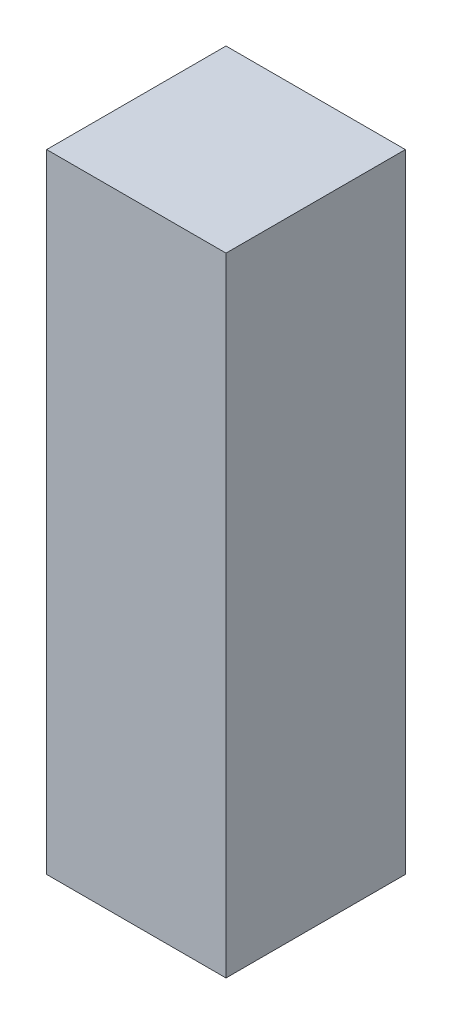
ISO-10303-21;
HEADER;
FILE_DESCRIPTION(('STEP AP214'),'2;1');
FILE_NAME('part.step','',(''),(''),'','','');
FILE_SCHEMA(('AUTOMOTIVE_DESIGN { 1 0 10303 214 1 1 1 1 }'));
ENDSEC;
DATA;
#1=APPLICATION_CONTEXT('core data for automotive mechanical design processes');
#2=APPLICATION_PROTOCOL_DEFINITION('international standard','automotive_design',2000,#1);
#3=PRODUCT_CONTEXT('',#1,'mechanical');
#4=PRODUCT('Part','Part','',(#3));
#5=PRODUCT_RELATED_PRODUCT_CATEGORY('part','',(#4));
#6=PRODUCT_DEFINITION_FORMATION('','',#4);
#7=PRODUCT_DEFINITION_CONTEXT('part definition',#1,'design');
#8=PRODUCT_DEFINITION('design','',#6,#7);
#9=PRODUCT_DEFINITION_SHAPE('','',#8);
#10=(LENGTH_UNIT() NAMED_UNIT(*) SI_UNIT(.MILLI.,.METRE.));
#11=(NAMED_UNIT(*) PLANE_ANGLE_UNIT() SI_UNIT($,.RADIAN.));
#12=(NAMED_UNIT(*) SI_UNIT($,.STERADIAN.) SOLID_ANGLE_UNIT());
#13=UNCERTAINTY_MEASURE_WITH_UNIT(LENGTH_MEASURE(1.E-05),#10,'distance_accuracy_value','');
#14=(GEOMETRIC_REPRESENTATION_CONTEXT(3) GLOBAL_UNCERTAINTY_ASSIGNED_CONTEXT((#13)) GLOBAL_UNIT_ASSIGNED_CONTEXT((#10,
#11,#12)) REPRESENTATION_CONTEXT('',''));
#15=CARTESIAN_POINT('',(0.,0.,0.));
#16=DIRECTION('',(0.,0.,1.));
#17=DIRECTION('',(1.,0.,0.));
#18=AXIS2_PLACEMENT_3D('',#15,#16,#17);
#19=CARTESIAN_POINT('',(12.7,44.45,12.7));
#20=DIRECTION('',(-1.,0.,0.));
#21=DIRECTION('',(0.,0.,1.));
#22=AXIS2_PLACEMENT_3D('',#19,#20,#21);
#23=PLANE('',#22);
#24=DIRECTION('',(0.,0.,-1.));
#25=VECTOR('',#24,1.);
#26=CARTESIAN_POINT('',(12.7,-44.45,12.7));
#27=LINE('',#26,#25);
#28=CARTESIAN_POINT('',(12.7,-44.45,12.7));
#29=VERTEX_POINT('',#28);
#30=CARTESIAN_POINT('',(12.7,-44.45,-12.7));
#31=VERTEX_POINT('',#30);
#32=EDGE_CURVE('E107',#29,#31,#27,.T.);
#33=ORIENTED_EDGE('',*,*,#32,.T.);
#34=DIRECTION('',(0.,-1.,0.));
#35=VECTOR('',#34,1.);
#36=CARTESIAN_POINT('',(12.7,44.45,-12.7));
#37=LINE('',#36,#35);
#38=CARTESIAN_POINT('',(12.7,44.45,-12.7));
#39=VERTEX_POINT('',#38);
#40=EDGE_CURVE('E11',#39,#31,#37,.T.);
#41=ORIENTED_EDGE('',*,*,#40,.F.);
#42=DIRECTION('',(0.,0.,-1.));
#43=VECTOR('',#42,1.);
#44=CARTESIAN_POINT('',(12.7,44.45,12.7));
#45=LINE('',#44,#43);
#46=CARTESIAN_POINT('',(12.7,44.45,12.7));
#47=VERTEX_POINT('',#46);
#48=EDGE_CURVE('E91',#47,#39,#45,.T.);
#49=ORIENTED_EDGE('',*,*,#48,.F.);
#50=DIRECTION('',(0.,-1.,0.));
#51=VECTOR('',#50,1.);
#52=CARTESIAN_POINT('',(12.7,44.45,12.7));
#53=LINE('',#52,#51);
#54=EDGE_CURVE('E103',#47,#29,#53,.T.);
#55=ORIENTED_EDGE('',*,*,#54,.T.);
#56=EDGE_LOOP('',(#33,#41,#49,#55));
#57=FACE_BOUND('',#56,.T.);
#58=ADVANCED_FACE('F39',(#57),#23,.F.);
#59=CARTESIAN_POINT('',(-12.7,44.45,-12.7));
#60=DIRECTION('',(0.,0.,1.));
#61=DIRECTION('',(1.,0.,0.));
#62=AXIS2_PLACEMENT_3D('',#59,#60,#61);
#63=PLANE('',#62);
#64=DIRECTION('',(-1.,0.,0.));
#65=VECTOR('',#64,1.);
#66=CARTESIAN_POINT('',(-12.7,-44.45,-12.7));
#67=LINE('',#66,#65);
#68=CARTESIAN_POINT('',(-12.7,-44.45,-12.7));
#69=VERTEX_POINT('',#68);
#70=EDGE_CURVE('E96',#31,#69,#67,.T.);
#71=ORIENTED_EDGE('',*,*,#70,.T.);
#72=DIRECTION('',(0.,-1.,0.));
#73=VECTOR('',#72,1.);
#74=CARTESIAN_POINT('',(-12.7,44.45,-12.7));
#75=LINE('',#74,#73);
#76=CARTESIAN_POINT('',(-12.7,44.45,-12.7));
#77=VERTEX_POINT('',#76);
#78=EDGE_CURVE('E48',#77,#69,#75,.T.);
#79=ORIENTED_EDGE('',*,*,#78,.F.);
#80=DIRECTION('',(-1.,0.,0.));
#81=VECTOR('',#80,1.);
#82=CARTESIAN_POINT('',(-12.7,44.45,-12.7));
#83=LINE('',#82,#81);
#84=EDGE_CURVE('E86',#39,#77,#83,.T.);
#85=ORIENTED_EDGE('',*,*,#84,.F.);
#86=ORIENTED_EDGE('',*,*,#40,.T.);
#87=EDGE_LOOP('',(#71,#79,#85,#86));
#88=FACE_BOUND('',#87,.T.);
#89=ADVANCED_FACE('F95',(#88),#63,.F.);
#90=CARTESIAN_POINT('',(-12.7,44.45,12.7));
#91=DIRECTION('',(1.,0.,0.));
#92=DIRECTION('',(0.,0.,-1.));
#93=AXIS2_PLACEMENT_3D('',#90,#91,#92);
#94=PLANE('',#93);
#95=DIRECTION('',(0.,0.,1.));
#96=VECTOR('',#95,1.);
#97=CARTESIAN_POINT('',(-12.7,-44.45,12.7));
#98=LINE('',#97,#96);
#99=CARTESIAN_POINT('',(-12.7,-44.45,12.7));
#100=VERTEX_POINT('',#99);
#101=EDGE_CURVE('E73',#69,#100,#98,.T.);
#102=ORIENTED_EDGE('',*,*,#101,.T.);
#103=DIRECTION('',(0.,-1.,0.));
#104=VECTOR('',#103,1.);
#105=CARTESIAN_POINT('',(-12.7,44.45,12.7));
#106=LINE('',#105,#104);
#107=CARTESIAN_POINT('',(-12.7,44.45,12.7));
#108=VERTEX_POINT('',#107);
#109=EDGE_CURVE('E98',#108,#100,#106,.T.);
#110=ORIENTED_EDGE('',*,*,#109,.F.);
#111=DIRECTION('',(0.,0.,1.));
#112=VECTOR('',#111,1.);
#113=CARTESIAN_POINT('',(-12.7,44.45,12.7));
#114=LINE('',#113,#112);
#115=EDGE_CURVE('E89',#77,#108,#114,.T.);
#116=ORIENTED_EDGE('',*,*,#115,.F.);
#117=ORIENTED_EDGE('',*,*,#78,.T.);
#118=EDGE_LOOP('',(#102,#110,#116,#117));
#119=FACE_BOUND('',#118,.T.);
#120=ADVANCED_FACE('F99',(#119),#94,.F.);
#121=CARTESIAN_POINT('',(-12.7,44.45,12.7));
#122=DIRECTION('',(0.,0.,-1.));
#123=DIRECTION('',(-1.,0.,0.));
#124=AXIS2_PLACEMENT_3D('',#121,#122,#123);
#125=PLANE('',#124);
#126=DIRECTION('',(1.,0.,0.));
#127=VECTOR('',#126,1.);
#128=CARTESIAN_POINT('',(-12.7,-44.45,12.7));
#129=LINE('',#128,#127);
#130=EDGE_CURVE('E79',#100,#29,#129,.T.);
#131=ORIENTED_EDGE('',*,*,#130,.T.);
#132=ORIENTED_EDGE('',*,*,#54,.F.);
#133=DIRECTION('',(1.,0.,0.));
#134=VECTOR('',#133,1.);
#135=CARTESIAN_POINT('',(-12.7,44.45,12.7));
#136=LINE('',#135,#134);
#137=EDGE_CURVE('E56',#108,#47,#136,.T.);
#138=ORIENTED_EDGE('',*,*,#137,.F.);
#139=ORIENTED_EDGE('',*,*,#109,.T.);
#140=EDGE_LOOP('',(#131,#132,#138,#139));
#141=FACE_BOUND('',#140,.T.);
#142=ADVANCED_FACE('F120',(#141),#125,.F.);
#143=CARTESIAN_POINT('',(0.,44.45,0.));
#144=DIRECTION('',(0.,-1.,0.));
#145=DIRECTION('',(0.,0.,-1.));
#146=AXIS2_PLACEMENT_3D('',#143,#144,#145);
#147=PLANE('',#146);
#148=ORIENTED_EDGE('',*,*,#48,.T.);
#149=ORIENTED_EDGE('',*,*,#84,.T.);
#150=ORIENTED_EDGE('',*,*,#115,.T.);
#151=ORIENTED_EDGE('',*,*,#137,.T.);
#152=EDGE_LOOP('',(#148,#149,#150,#151));
#153=FACE_BOUND('',#152,.T.);
#154=ADVANCED_FACE('F87',(#153),#147,.F.);
#155=CARTESIAN_POINT('',(0.,-44.45,0.));
#156=DIRECTION('',(0.,-1.,0.));
#157=DIRECTION('',(0.,0.,-1.));
#158=AXIS2_PLACEMENT_3D('',#155,#156,#157);
#159=PLANE('',#158);
#160=ORIENTED_EDGE('',*,*,#32,.F.);
#161=ORIENTED_EDGE('',*,*,#130,.F.);
#162=ORIENTED_EDGE('',*,*,#101,.F.);
#163=ORIENTED_EDGE('',*,*,#70,.F.);
#164=EDGE_LOOP('',(#160,#161,#162,#163));
#165=FACE_BOUND('',#164,.T.);
#166=ADVANCED_FACE('F123',(#165),#159,.T.);
#167=CLOSED_SHELL('',(#58,#89,#120,#142,#154,#166));
#168=MANIFOLD_SOLID_BREP('B2',#167);
#169=ADVANCED_BREP_SHAPE_REPRESENTATION('',(#18,#168),#14);
#170=SHAPE_DEFINITION_REPRESENTATION(#9,#169);
ENDSEC;
END-ISO-10303-21;
